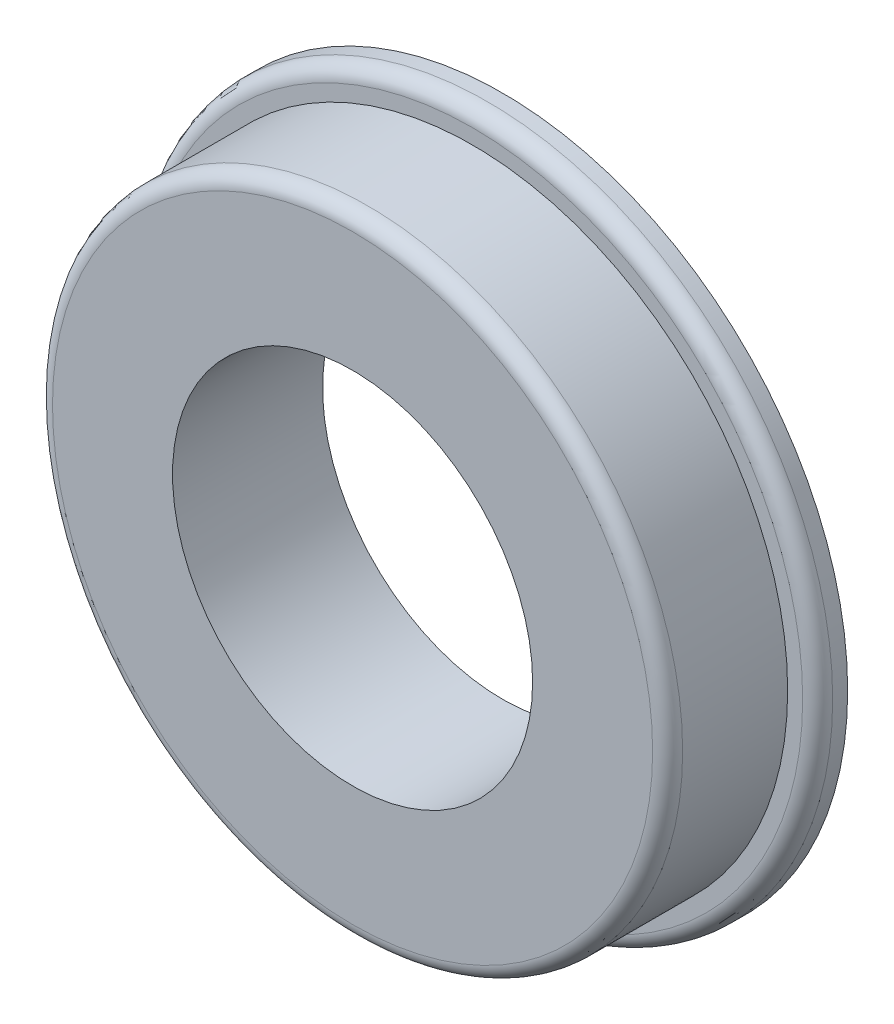
ISO-10303-21;
HEADER;
FILE_DESCRIPTION(('STEP AP214'),'2;1');
FILE_NAME('part.step','',(''),(''),'','','');
FILE_SCHEMA(('AUTOMOTIVE_DESIGN { 1 0 10303 214 1 1 1 1 }'));
ENDSEC;
DATA;
#1=APPLICATION_CONTEXT('core data for automotive mechanical design processes');
#2=APPLICATION_PROTOCOL_DEFINITION('international standard','automotive_design',2000,#1);
#3=PRODUCT_CONTEXT('',#1,'mechanical');
#4=PRODUCT('Part','Part','',(#3));
#5=PRODUCT_RELATED_PRODUCT_CATEGORY('part','',(#4));
#6=PRODUCT_DEFINITION_FORMATION('','',#4);
#7=PRODUCT_DEFINITION_CONTEXT('part definition',#1,'design');
#8=PRODUCT_DEFINITION('design','',#6,#7);
#9=PRODUCT_DEFINITION_SHAPE('','',#8);
#10=(LENGTH_UNIT() NAMED_UNIT(*) SI_UNIT(.MILLI.,.METRE.));
#11=(NAMED_UNIT(*) PLANE_ANGLE_UNIT() SI_UNIT($,.RADIAN.));
#12=(NAMED_UNIT(*) SI_UNIT($,.STERADIAN.) SOLID_ANGLE_UNIT());
#13=UNCERTAINTY_MEASURE_WITH_UNIT(LENGTH_MEASURE(1.E-05),#10,'distance_accuracy_value','');
#14=(GEOMETRIC_REPRESENTATION_CONTEXT(3) GLOBAL_UNCERTAINTY_ASSIGNED_CONTEXT((#13)) GLOBAL_UNIT_ASSIGNED_CONTEXT((#10,
#11,#12)) REPRESENTATION_CONTEXT('',''));
#15=CARTESIAN_POINT('',(0.,0.,0.));
#16=DIRECTION('',(0.,0.,1.));
#17=DIRECTION('',(1.,0.,0.));
#18=AXIS2_PLACEMENT_3D('',#15,#16,#17);
#19=CARTESIAN_POINT('',(0.,0.,1.));
#20=DIRECTION('',(0.,0.,1.));
#21=DIRECTION('',(1.,0.,0.));
#22=AXIS2_PLACEMENT_3D('',#19,#20,#21);
#23=PLANE('',#22);
#24=CARTESIAN_POINT('',(0.,0.,1.));
#25=DIRECTION('',(0.,0.,1.));
#26=DIRECTION('',(1.,0.,0.));
#27=AXIS2_PLACEMENT_3D('',#24,#25,#26);
#28=CIRCLE('',#27,11.);
#29=CARTESIAN_POINT('',(11.,0.,1.));
#30=VERTEX_POINT('',#29);
#31=EDGE_CURVE('E51',#30,#30,#28,.T.);
#32=ORIENTED_EDGE('',*,*,#31,.T.);
#33=EDGE_LOOP('',(#32));
#34=FACE_BOUND('',#33,.T.);
#35=CARTESIAN_POINT('',(0.,0.,1.));
#36=DIRECTION('',(0.,0.,1.));
#37=DIRECTION('',(1.,0.,0.));
#38=AXIS2_PLACEMENT_3D('',#35,#36,#37);
#39=CIRCLE('',#38,10.5);
#40=CARTESIAN_POINT('',(10.5,0.,1.));
#41=VERTEX_POINT('',#40);
#42=EDGE_CURVE('E59',#41,#41,#39,.T.);
#43=ORIENTED_EDGE('',*,*,#42,.F.);
#44=EDGE_LOOP('',(#43));
#45=FACE_BOUND('',#44,.T.);
#46=ADVANCED_FACE('F36',(#34,#45),#23,.T.);
#47=CARTESIAN_POINT('',(0.,0.,1.));
#48=DIRECTION('',(0.,0.,-1.));
#49=DIRECTION('',(-1.,0.,0.));
#50=AXIS2_PLACEMENT_3D('',#47,#48,#49);
#51=CYLINDRICAL_SURFACE('',#50,11.5);
#52=CARTESIAN_POINT('',(0.,0.,0.5));
#53=DIRECTION('',(0.,0.,1.));
#54=DIRECTION('',(1.,0.,0.));
#55=AXIS2_PLACEMENT_3D('',#52,#53,#54);
#56=CIRCLE('',#55,11.5);
#57=CARTESIAN_POINT('',(11.5,0.,0.5));
#58=VERTEX_POINT('',#57);
#59=EDGE_CURVE('E47',#58,#58,#56,.F.);
#60=ORIENTED_EDGE('',*,*,#59,.T.);
#61=EDGE_LOOP('',(#60));
#62=FACE_BOUND('',#61,.T.);
#63=CARTESIAN_POINT('',(0.,0.,0.));
#64=DIRECTION('',(0.,0.,1.));
#65=DIRECTION('',(1.,0.,0.));
#66=AXIS2_PLACEMENT_3D('',#63,#64,#65);
#67=CIRCLE('',#66,11.5);
#68=CARTESIAN_POINT('',(11.5,0.,0.));
#69=VERTEX_POINT('',#68);
#70=EDGE_CURVE('E56',#69,#69,#67,.T.);
#71=ORIENTED_EDGE('',*,*,#70,.T.);
#72=EDGE_LOOP('',(#71));
#73=FACE_BOUND('',#72,.T.);
#74=ADVANCED_FACE('F85',(#62,#73),#51,.T.);
#75=CARTESIAN_POINT('',(0.,0.,0.));
#76=DIRECTION('',(0.,0.,1.));
#77=DIRECTION('',(1.,0.,0.));
#78=AXIS2_PLACEMENT_3D('',#75,#76,#77);
#79=PLANE('',#78);
#80=CARTESIAN_POINT('',(0.,0.,0.));
#81=DIRECTION('',(0.,0.,1.));
#82=DIRECTION('',(1.,0.,0.));
#83=AXIS2_PLACEMENT_3D('',#80,#81,#82);
#84=CIRCLE('',#83,6.);
#85=CARTESIAN_POINT('',(6.,0.,0.));
#86=VERTEX_POINT('',#85);
#87=EDGE_CURVE('E62',#86,#86,#84,.T.);
#88=ORIENTED_EDGE('',*,*,#87,.T.);
#89=EDGE_LOOP('',(#88));
#90=FACE_BOUND('',#89,.T.);
#91=ORIENTED_EDGE('',*,*,#70,.F.);
#92=EDGE_LOOP('',(#91));
#93=FACE_BOUND('',#92,.T.);
#94=ADVANCED_FACE('F82',(#90,#93),#79,.F.);
#95=CARTESIAN_POINT('',(0.,0.,5.));
#96=DIRECTION('',(0.,0.,-1.));
#97=DIRECTION('',(-1.,0.,0.));
#98=AXIS2_PLACEMENT_3D('',#95,#96,#97);
#99=CYLINDRICAL_SURFACE('',#98,10.5);
#100=CARTESIAN_POINT('',(0.,0.,4.5));
#101=DIRECTION('',(0.,0.,1.));
#102=DIRECTION('',(1.,0.,0.));
#103=AXIS2_PLACEMENT_3D('',#100,#101,#102);
#104=CIRCLE('',#103,10.5);
#105=CARTESIAN_POINT('',(10.5,0.,4.5));
#106=VERTEX_POINT('',#105);
#107=EDGE_CURVE('E10',#106,#106,#104,.F.);
#108=ORIENTED_EDGE('',*,*,#107,.T.);
#109=EDGE_LOOP('',(#108));
#110=FACE_BOUND('',#109,.T.);
#111=ORIENTED_EDGE('',*,*,#42,.T.);
#112=EDGE_LOOP('',(#111));
#113=FACE_BOUND('',#112,.T.);
#114=ADVANCED_FACE('F74',(#110,#113),#99,.T.);
#115=CARTESIAN_POINT('',(0.,0.,5.));
#116=DIRECTION('',(0.,0.,1.));
#117=DIRECTION('',(1.,0.,0.));
#118=AXIS2_PLACEMENT_3D('',#115,#116,#117);
#119=PLANE('',#118);
#120=CARTESIAN_POINT('',(0.,0.,5.));
#121=DIRECTION('',(0.,0.,1.));
#122=DIRECTION('',(1.,0.,0.));
#123=AXIS2_PLACEMENT_3D('',#120,#121,#122);
#124=CIRCLE('',#123,10.);
#125=CARTESIAN_POINT('',(10.,0.,5.));
#126=VERTEX_POINT('',#125);
#127=EDGE_CURVE('E43',#126,#126,#124,.T.);
#128=ORIENTED_EDGE('',*,*,#127,.T.);
#129=EDGE_LOOP('',(#128));
#130=FACE_BOUND('',#129,.T.);
#131=CARTESIAN_POINT('',(0.,0.,5.));
#132=DIRECTION('',(0.,0.,1.));
#133=DIRECTION('',(1.,0.,0.));
#134=AXIS2_PLACEMENT_3D('',#131,#132,#133);
#135=CIRCLE('',#134,6.);
#136=CARTESIAN_POINT('',(6.,0.,5.));
#137=VERTEX_POINT('',#136);
#138=EDGE_CURVE('E65',#137,#137,#135,.T.);
#139=ORIENTED_EDGE('',*,*,#138,.F.);
#140=EDGE_LOOP('',(#139));
#141=FACE_BOUND('',#140,.T.);
#142=ADVANCED_FACE('F72',(#130,#141),#119,.T.);
#143=CARTESIAN_POINT('',(0.,0.,-4.));
#144=DIRECTION('',(0.,0.,1.));
#145=DIRECTION('',(1.,0.,0.));
#146=AXIS2_PLACEMENT_3D('',#143,#144,#145);
#147=CYLINDRICAL_SURFACE('',#146,6.);
#148=ORIENTED_EDGE('',*,*,#138,.T.);
#149=EDGE_LOOP('',(#148));
#150=FACE_BOUND('',#149,.T.);
#151=ORIENTED_EDGE('',*,*,#87,.F.);
#152=EDGE_LOOP('',(#151));
#153=FACE_BOUND('',#152,.T.);
#154=ADVANCED_FACE('F69',(#150,#153),#147,.F.);
#155=CARTESIAN_POINT('',(0.,0.,0.5));
#156=DIRECTION('',(0.,0.,1.));
#157=DIRECTION('',(1.,0.,0.));
#158=AXIS2_PLACEMENT_3D('',#155,#156,#157);
#159=TOROIDAL_SURFACE('',#158,11.,0.5);
#160=ORIENTED_EDGE('',*,*,#59,.F.);
#161=EDGE_LOOP('',(#160));
#162=FACE_BOUND('',#161,.T.);
#163=ORIENTED_EDGE('',*,*,#31,.F.);
#164=EDGE_LOOP('',(#163));
#165=FACE_BOUND('',#164,.T.);
#166=ADVANCED_FACE('F80',(#162,#165),#159,.T.);
#167=CARTESIAN_POINT('',(0.,0.,4.5));
#168=DIRECTION('',(0.,0.,1.));
#169=DIRECTION('',(1.,0.,0.));
#170=AXIS2_PLACEMENT_3D('',#167,#168,#169);
#171=TOROIDAL_SURFACE('',#170,10.,0.5);
#172=ORIENTED_EDGE('',*,*,#107,.F.);
#173=EDGE_LOOP('',(#172));
#174=FACE_BOUND('',#173,.T.);
#175=ORIENTED_EDGE('',*,*,#127,.F.);
#176=EDGE_LOOP('',(#175));
#177=FACE_BOUND('',#176,.T.);
#178=ADVANCED_FACE('F38',(#174,#177),#171,.T.);
#179=CLOSED_SHELL('',(#46,#74,#94,#114,#142,#154,#166,#178));
#180=MANIFOLD_SOLID_BREP('B2',#179);
#181=ADVANCED_BREP_SHAPE_REPRESENTATION('',(#18,#180),#14);
#182=SHAPE_DEFINITION_REPRESENTATION(#9,#181);
ENDSEC;
END-ISO-10303-21;
